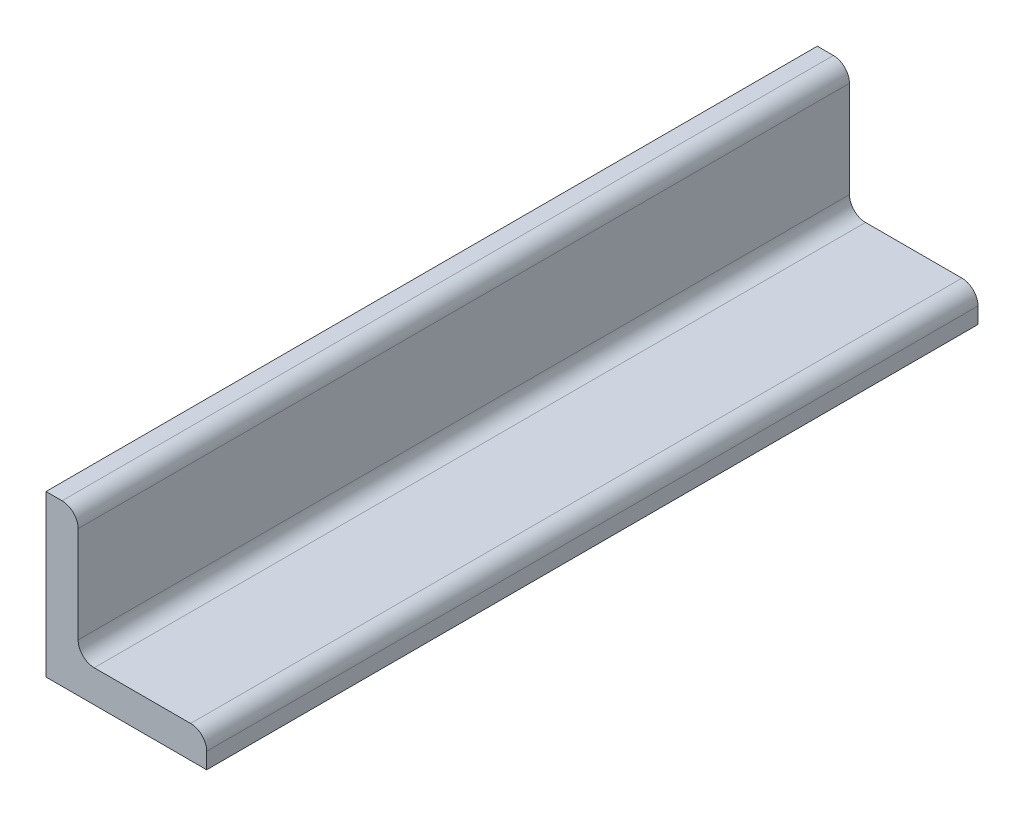
ISO-10303-21;
HEADER;
FILE_DESCRIPTION(('STEP AP214'),'2;1');
FILE_NAME('part.step','',(''),(''),'','','');
FILE_SCHEMA(('AUTOMOTIVE_DESIGN { 1 0 10303 214 1 1 1 1 }'));
ENDSEC;
DATA;
#1=APPLICATION_CONTEXT('core data for automotive mechanical design processes');
#2=APPLICATION_PROTOCOL_DEFINITION('international standard','automotive_design',2000,#1);
#3=PRODUCT_CONTEXT('',#1,'mechanical');
#4=PRODUCT('Part','Part','',(#3));
#5=PRODUCT_RELATED_PRODUCT_CATEGORY('part','',(#4));
#6=PRODUCT_DEFINITION_FORMATION('','',#4);
#7=PRODUCT_DEFINITION_CONTEXT('part definition',#1,'design');
#8=PRODUCT_DEFINITION('design','',#6,#7);
#9=PRODUCT_DEFINITION_SHAPE('','',#8);
#10=(LENGTH_UNIT() NAMED_UNIT(*) SI_UNIT(.MILLI.,.METRE.));
#11=(NAMED_UNIT(*) PLANE_ANGLE_UNIT() SI_UNIT($,.RADIAN.));
#12=(NAMED_UNIT(*) SI_UNIT($,.STERADIAN.) SOLID_ANGLE_UNIT());
#13=UNCERTAINTY_MEASURE_WITH_UNIT(LENGTH_MEASURE(1.E-05),#10,'distance_accuracy_value','');
#14=(GEOMETRIC_REPRESENTATION_CONTEXT(3) GLOBAL_UNCERTAINTY_ASSIGNED_CONTEXT((#13)) GLOBAL_UNIT_ASSIGNED_CONTEXT((#10,
#11,#12)) REPRESENTATION_CONTEXT('',''));
#15=CARTESIAN_POINT('',(0.,0.,0.));
#16=DIRECTION('',(0.,0.,1.));
#17=DIRECTION('',(1.,0.,0.));
#18=AXIS2_PLACEMENT_3D('',#15,#16,#17);
#19=CARTESIAN_POINT('',(0.897927251325018,63.8534276781816,304.8));
#20=DIRECTION('',(1.,0.,0.));
#21=DIRECTION('',(0.,0.,-1.));
#22=AXIS2_PLACEMENT_3D('',#19,#20,#21);
#23=PLANE('',#22);
#24=DIRECTION('',(0.,-1.,0.));
#25=VECTOR('',#24,1.);
#26=CARTESIAN_POINT('',(0.897927251325018,63.8534276781816,0.));
#27=LINE('',#26,#25);
#28=CARTESIAN_POINT('',(0.897927251325018,63.8534276781816,0.));
#29=VERTEX_POINT('',#28);
#30=CARTESIAN_POINT('',(0.897927251325018,0.353427678181561,0.));
#31=VERTEX_POINT('',#30);
#32=EDGE_CURVE('E135',#29,#31,#27,.T.);
#33=ORIENTED_EDGE('',*,*,#32,.T.);
#34=DIRECTION('',(0.,0.,-1.));
#35=VECTOR('',#34,1.);
#36=CARTESIAN_POINT('',(0.897927251325018,0.353427678181561,304.8));
#37=LINE('',#36,#35);
#38=CARTESIAN_POINT('',(0.897927251325018,0.353427678181561,304.8));
#39=VERTEX_POINT('',#38);
#40=EDGE_CURVE('E11',#39,#31,#37,.T.);
#41=ORIENTED_EDGE('',*,*,#40,.F.);
#42=DIRECTION('',(0.,-1.,0.));
#43=VECTOR('',#42,1.);
#44=CARTESIAN_POINT('',(0.897927251325018,63.8534276781816,304.8));
#45=LINE('',#44,#43);
#46=CARTESIAN_POINT('',(0.897927251325018,63.8534276781816,304.8));
#47=VERTEX_POINT('',#46);
#48=EDGE_CURVE('E151',#47,#39,#45,.T.);
#49=ORIENTED_EDGE('',*,*,#48,.F.);
#50=DIRECTION('',(0.,0.,-1.));
#51=VECTOR('',#50,1.);
#52=CARTESIAN_POINT('',(0.897927251325018,63.8534276781816,304.8));
#53=LINE('',#52,#51);
#54=EDGE_CURVE('E131',#47,#29,#53,.T.);
#55=ORIENTED_EDGE('',*,*,#54,.T.);
#56=EDGE_LOOP('',(#33,#41,#49,#55));
#57=FACE_BOUND('',#56,.T.);
#58=ADVANCED_FACE('F33',(#57),#23,.F.);
#59=CARTESIAN_POINT('',(0.897927251325018,0.353427678181561,304.8));
#60=DIRECTION('',(0.,1.,0.));
#61=DIRECTION('',(0.,0.,1.));
#62=AXIS2_PLACEMENT_3D('',#59,#60,#61);
#63=PLANE('',#62);
#64=DIRECTION('',(1.,0.,0.));
#65=VECTOR('',#64,1.);
#66=CARTESIAN_POINT('',(0.897927251325018,0.353427678181561,0.));
#67=LINE('',#66,#65);
#68=CARTESIAN_POINT('',(64.397927251325,0.353427678181561,0.));
#69=VERTEX_POINT('',#68);
#70=EDGE_CURVE('E138',#31,#69,#67,.T.);
#71=ORIENTED_EDGE('',*,*,#70,.T.);
#72=DIRECTION('',(0.,0.,-1.));
#73=VECTOR('',#72,1.);
#74=CARTESIAN_POINT('',(64.397927251325,0.353427678181561,304.8));
#75=LINE('',#74,#73);
#76=CARTESIAN_POINT('',(64.397927251325,0.353427678181561,304.8));
#77=VERTEX_POINT('',#76);
#78=EDGE_CURVE('E41',#77,#69,#75,.T.);
#79=ORIENTED_EDGE('',*,*,#78,.F.);
#80=DIRECTION('',(1.,0.,0.));
#81=VECTOR('',#80,1.);
#82=CARTESIAN_POINT('',(0.897927251325018,0.353427678181561,304.8));
#83=LINE('',#82,#81);
#84=EDGE_CURVE('E95',#39,#77,#83,.T.);
#85=ORIENTED_EDGE('',*,*,#84,.F.);
#86=ORIENTED_EDGE('',*,*,#40,.T.);
#87=EDGE_LOOP('',(#71,#79,#85,#86));
#88=FACE_BOUND('',#87,.T.);
#89=ADVANCED_FACE('F194',(#88),#63,.F.);
#90=CARTESIAN_POINT('',(64.397927251325,0.353427678181561,304.8));
#91=DIRECTION('',(-1.,0.,0.));
#92=DIRECTION('',(0.,0.,1.));
#93=AXIS2_PLACEMENT_3D('',#90,#91,#92);
#94=PLANE('',#93);
#95=DIRECTION('',(0.,1.,0.));
#96=VECTOR('',#95,1.);
#97=CARTESIAN_POINT('',(64.397927251325,0.353427678181561,0.));
#98=LINE('',#97,#96);
#99=CARTESIAN_POINT('',(64.397927251325,6.70342767818156,0.));
#100=VERTEX_POINT('',#99);
#101=EDGE_CURVE('E140',#69,#100,#98,.T.);
#102=ORIENTED_EDGE('',*,*,#101,.T.);
#103=DIRECTION('',(0.,0.,-1.));
#104=VECTOR('',#103,1.);
#105=CARTESIAN_POINT('',(64.397927251325,6.70342767818156,304.8));
#106=LINE('',#105,#104);
#107=CARTESIAN_POINT('',(64.397927251325,6.70342767818156,304.8));
#108=VERTEX_POINT('',#107);
#109=EDGE_CURVE('E161',#108,#100,#106,.T.);
#110=ORIENTED_EDGE('',*,*,#109,.F.);
#111=DIRECTION('',(0.,1.,0.));
#112=VECTOR('',#111,1.);
#113=CARTESIAN_POINT('',(64.397927251325,0.353427678181561,304.8));
#114=LINE('',#113,#112);
#115=EDGE_CURVE('E169',#77,#108,#114,.T.);
#116=ORIENTED_EDGE('',*,*,#115,.F.);
#117=ORIENTED_EDGE('',*,*,#78,.T.);
#118=EDGE_LOOP('',(#102,#110,#116,#117));
#119=FACE_BOUND('',#118,.T.);
#120=ADVANCED_FACE('F167',(#119),#94,.F.);
#121=CARTESIAN_POINT('',(58.047927251325,6.70342767818156,304.8));
#122=DIRECTION('',(0.,0.,-1.));
#123=DIRECTION('',(-1.,0.,0.));
#124=AXIS2_PLACEMENT_3D('',#121,#122,#123);
#125=CYLINDRICAL_SURFACE('',#124,6.35);
#126=CARTESIAN_POINT('',(58.047927251325,6.70342767818156,0.));
#127=DIRECTION('',(0.,0.,1.));
#128=DIRECTION('',(1.,0.,0.));
#129=AXIS2_PLACEMENT_3D('',#126,#127,#128);
#130=CIRCLE('',#129,6.35);
#131=CARTESIAN_POINT('',(58.047927251325,13.0534276781816,0.));
#132=VERTEX_POINT('',#131);
#133=EDGE_CURVE('E142',#100,#132,#130,.T.);
#134=ORIENTED_EDGE('',*,*,#133,.T.);
#135=DIRECTION('',(0.,0.,-1.));
#136=VECTOR('',#135,1.);
#137=CARTESIAN_POINT('',(58.047927251325,13.0534276781816,304.8));
#138=LINE('',#137,#136);
#139=CARTESIAN_POINT('',(58.047927251325,13.0534276781816,304.8));
#140=VERTEX_POINT('',#139);
#141=EDGE_CURVE('E158',#140,#132,#138,.T.);
#142=ORIENTED_EDGE('',*,*,#141,.F.);
#143=CARTESIAN_POINT('',(58.047927251325,6.70342767818156,304.8));
#144=DIRECTION('',(0.,0.,1.));
#145=DIRECTION('',(1.,0.,0.));
#146=AXIS2_PLACEMENT_3D('',#143,#144,#145);
#147=CIRCLE('',#146,6.35);
#148=EDGE_CURVE('E185',#108,#140,#147,.T.);
#149=ORIENTED_EDGE('',*,*,#148,.F.);
#150=ORIENTED_EDGE('',*,*,#109,.T.);
#151=EDGE_LOOP('',(#134,#142,#149,#150));
#152=FACE_BOUND('',#151,.T.);
#153=ADVANCED_FACE('F178',(#152),#125,.T.);
#154=CARTESIAN_POINT('',(58.047927251325,13.0534276781816,304.8));
#155=DIRECTION('',(0.,-1.,0.));
#156=DIRECTION('',(0.,0.,-1.));
#157=AXIS2_PLACEMENT_3D('',#154,#155,#156);
#158=PLANE('',#157);
#159=DIRECTION('',(-1.,0.,0.));
#160=VECTOR('',#159,1.);
#161=CARTESIAN_POINT('',(58.047927251325,13.0534276781816,0.));
#162=LINE('',#161,#160);
#163=CARTESIAN_POINT('',(19.947927251325,13.0534276781816,0.));
#164=VERTEX_POINT('',#163);
#165=EDGE_CURVE('E144',#132,#164,#162,.T.);
#166=ORIENTED_EDGE('',*,*,#165,.T.);
#167=DIRECTION('',(0.,0.,-1.));
#168=VECTOR('',#167,1.);
#169=CARTESIAN_POINT('',(19.947927251325,13.0534276781816,304.8));
#170=LINE('',#169,#168);
#171=CARTESIAN_POINT('',(19.947927251325,13.0534276781816,304.8));
#172=VERTEX_POINT('',#171);
#173=EDGE_CURVE('E155',#172,#164,#170,.T.);
#174=ORIENTED_EDGE('',*,*,#173,.F.);
#175=DIRECTION('',(-1.,0.,0.));
#176=VECTOR('',#175,1.);
#177=CARTESIAN_POINT('',(58.047927251325,13.0534276781816,304.8));
#178=LINE('',#177,#176);
#179=EDGE_CURVE('E184',#140,#172,#178,.T.);
#180=ORIENTED_EDGE('',*,*,#179,.F.);
#181=ORIENTED_EDGE('',*,*,#141,.T.);
#182=EDGE_LOOP('',(#166,#174,#180,#181));
#183=FACE_BOUND('',#182,.T.);
#184=ADVANCED_FACE('F182',(#183),#158,.F.);
#185=CARTESIAN_POINT('',(19.947927251325,19.4034276781816,304.8));
#186=DIRECTION('',(0.,0.,-1.));
#187=DIRECTION('',(-1.,0.,0.));
#188=AXIS2_PLACEMENT_3D('',#185,#186,#187);
#189=CYLINDRICAL_SURFACE('',#188,6.34999999999999);
#190=CARTESIAN_POINT('',(19.947927251325,19.4034276781816,0.));
#191=DIRECTION('',(0.,0.,-1.));
#192=DIRECTION('',(1.,0.,0.));
#193=AXIS2_PLACEMENT_3D('',#190,#191,#192);
#194=CIRCLE('',#193,6.34999999999999);
#195=CARTESIAN_POINT('',(13.597927251325,19.4034276781816,0.));
#196=VERTEX_POINT('',#195);
#197=EDGE_CURVE('E146',#164,#196,#194,.T.);
#198=ORIENTED_EDGE('',*,*,#197,.T.);
#199=DIRECTION('',(0.,0.,-1.));
#200=VECTOR('',#199,1.);
#201=CARTESIAN_POINT('',(13.597927251325,19.4034276781816,304.8));
#202=LINE('',#201,#200);
#203=CARTESIAN_POINT('',(13.597927251325,19.4034276781816,304.8));
#204=VERTEX_POINT('',#203);
#205=EDGE_CURVE('E126',#204,#196,#202,.T.);
#206=ORIENTED_EDGE('',*,*,#205,.F.);
#207=CARTESIAN_POINT('',(19.947927251325,19.4034276781816,304.8));
#208=DIRECTION('',(0.,0.,-1.));
#209=DIRECTION('',(1.,0.,0.));
#210=AXIS2_PLACEMENT_3D('',#207,#208,#209);
#211=CIRCLE('',#210,6.34999999999999);
#212=EDGE_CURVE('E117',#172,#204,#211,.T.);
#213=ORIENTED_EDGE('',*,*,#212,.F.);
#214=ORIENTED_EDGE('',*,*,#173,.T.);
#215=EDGE_LOOP('',(#198,#206,#213,#214));
#216=FACE_BOUND('',#215,.T.);
#217=ADVANCED_FACE('F206',(#216),#189,.F.);
#218=CARTESIAN_POINT('',(13.597927251325,19.4034276781816,304.8));
#219=DIRECTION('',(-1.,0.,0.));
#220=DIRECTION('',(0.,0.,1.));
#221=AXIS2_PLACEMENT_3D('',#218,#219,#220);
#222=PLANE('',#221);
#223=DIRECTION('',(0.,1.,0.));
#224=VECTOR('',#223,1.);
#225=CARTESIAN_POINT('',(13.597927251325,19.4034276781816,0.));
#226=LINE('',#225,#224);
#227=CARTESIAN_POINT('',(13.597927251325,57.5034276781816,0.));
#228=VERTEX_POINT('',#227);
#229=EDGE_CURVE('E125',#196,#228,#226,.T.);
#230=ORIENTED_EDGE('',*,*,#229,.T.);
#231=DIRECTION('',(0.,0.,-1.));
#232=VECTOR('',#231,1.);
#233=CARTESIAN_POINT('',(13.597927251325,57.5034276781816,304.8));
#234=LINE('',#233,#232);
#235=CARTESIAN_POINT('',(13.597927251325,57.5034276781816,304.8));
#236=VERTEX_POINT('',#235);
#237=EDGE_CURVE('E122',#236,#228,#234,.T.);
#238=ORIENTED_EDGE('',*,*,#237,.F.);
#239=DIRECTION('',(0.,1.,0.));
#240=VECTOR('',#239,1.);
#241=CARTESIAN_POINT('',(13.597927251325,19.4034276781816,304.8));
#242=LINE('',#241,#240);
#243=EDGE_CURVE('E111',#204,#236,#242,.T.);
#244=ORIENTED_EDGE('',*,*,#243,.F.);
#245=ORIENTED_EDGE('',*,*,#205,.T.);
#246=EDGE_LOOP('',(#230,#238,#244,#245));
#247=FACE_BOUND('',#246,.T.);
#248=ADVANCED_FACE('F123',(#247),#222,.F.);
#249=CARTESIAN_POINT('',(7.24792725132502,57.5034276781816,304.8));
#250=DIRECTION('',(0.,0.,-1.));
#251=DIRECTION('',(-1.,0.,0.));
#252=AXIS2_PLACEMENT_3D('',#249,#250,#251);
#253=CYLINDRICAL_SURFACE('',#252,6.35);
#254=CARTESIAN_POINT('',(7.24792725132502,57.5034276781816,0.));
#255=DIRECTION('',(0.,0.,1.));
#256=DIRECTION('',(1.,0.,0.));
#257=AXIS2_PLACEMENT_3D('',#254,#255,#256);
#258=CIRCLE('',#257,6.35);
#259=CARTESIAN_POINT('',(7.24792725132502,63.8534276781816,0.));
#260=VERTEX_POINT('',#259);
#261=EDGE_CURVE('E81',#228,#260,#258,.T.);
#262=ORIENTED_EDGE('',*,*,#261,.T.);
#263=DIRECTION('',(0.,0.,-1.));
#264=VECTOR('',#263,1.);
#265=CARTESIAN_POINT('',(7.24792725132502,63.8534276781816,304.8));
#266=LINE('',#265,#264);
#267=CARTESIAN_POINT('',(7.24792725132502,63.8534276781816,304.8));
#268=VERTEX_POINT('',#267);
#269=EDGE_CURVE('E127',#268,#260,#266,.T.);
#270=ORIENTED_EDGE('',*,*,#269,.F.);
#271=CARTESIAN_POINT('',(7.24792725132502,57.5034276781816,304.8));
#272=DIRECTION('',(0.,0.,1.));
#273=DIRECTION('',(1.,0.,0.));
#274=AXIS2_PLACEMENT_3D('',#271,#272,#273);
#275=CIRCLE('',#274,6.35);
#276=EDGE_CURVE('E115',#236,#268,#275,.T.);
#277=ORIENTED_EDGE('',*,*,#276,.F.);
#278=ORIENTED_EDGE('',*,*,#237,.T.);
#279=EDGE_LOOP('',(#262,#270,#277,#278));
#280=FACE_BOUND('',#279,.T.);
#281=ADVANCED_FACE('F129',(#280),#253,.T.);
#282=CARTESIAN_POINT('',(7.24792725132502,63.8534276781816,304.8));
#283=DIRECTION('',(0.,-1.,0.));
#284=DIRECTION('',(0.,0.,-1.));
#285=AXIS2_PLACEMENT_3D('',#282,#283,#284);
#286=PLANE('',#285);
#287=DIRECTION('',(-1.,0.,0.));
#288=VECTOR('',#287,1.);
#289=CARTESIAN_POINT('',(7.24792725132502,63.8534276781816,0.));
#290=LINE('',#289,#288);
#291=EDGE_CURVE('E87',#260,#29,#290,.T.);
#292=ORIENTED_EDGE('',*,*,#291,.T.);
#293=ORIENTED_EDGE('',*,*,#54,.F.);
#294=DIRECTION('',(-1.,0.,0.));
#295=VECTOR('',#294,1.);
#296=CARTESIAN_POINT('',(7.24792725132502,63.8534276781816,304.8));
#297=LINE('',#296,#295);
#298=EDGE_CURVE('E49',#268,#47,#297,.T.);
#299=ORIENTED_EDGE('',*,*,#298,.F.);
#300=ORIENTED_EDGE('',*,*,#269,.T.);
#301=EDGE_LOOP('',(#292,#293,#299,#300));
#302=FACE_BOUND('',#301,.T.);
#303=ADVANCED_FACE('F214',(#302),#286,.F.);
#304=CARTESIAN_POINT('',(58.047927251325,6.70342767818156,304.8));
#305=DIRECTION('',(0.,0.,1.));
#306=DIRECTION('',(1.,0.,0.));
#307=AXIS2_PLACEMENT_3D('',#304,#305,#306);
#308=PLANE('',#307);
#309=ORIENTED_EDGE('',*,*,#48,.T.);
#310=ORIENTED_EDGE('',*,*,#84,.T.);
#311=ORIENTED_EDGE('',*,*,#115,.T.);
#312=ORIENTED_EDGE('',*,*,#148,.T.);
#313=ORIENTED_EDGE('',*,*,#179,.T.);
#314=ORIENTED_EDGE('',*,*,#212,.T.);
#315=ORIENTED_EDGE('',*,*,#243,.T.);
#316=ORIENTED_EDGE('',*,*,#276,.T.);
#317=ORIENTED_EDGE('',*,*,#298,.T.);
#318=EDGE_LOOP('',(#309,#310,#311,#312,#313,#314,#315,#316,#317));
#319=FACE_BOUND('',#318,.T.);
#320=ADVANCED_FACE('F113',(#319),#308,.T.);
#321=CARTESIAN_POINT('',(58.047927251325,6.70342767818156,0.));
#322=DIRECTION('',(0.,0.,1.));
#323=DIRECTION('',(1.,0.,0.));
#324=AXIS2_PLACEMENT_3D('',#321,#322,#323);
#325=PLANE('',#324);
#326=ORIENTED_EDGE('',*,*,#32,.F.);
#327=ORIENTED_EDGE('',*,*,#291,.F.);
#328=ORIENTED_EDGE('',*,*,#261,.F.);
#329=ORIENTED_EDGE('',*,*,#229,.F.);
#330=ORIENTED_EDGE('',*,*,#197,.F.);
#331=ORIENTED_EDGE('',*,*,#165,.F.);
#332=ORIENTED_EDGE('',*,*,#133,.F.);
#333=ORIENTED_EDGE('',*,*,#101,.F.);
#334=ORIENTED_EDGE('',*,*,#70,.F.);
#335=EDGE_LOOP('',(#326,#327,#328,#329,#330,#331,#332,#333,#334));
#336=FACE_BOUND('',#335,.T.);
#337=ADVANCED_FACE('F173',(#336),#325,.F.);
#338=CLOSED_SHELL('',(#58,#89,#120,#153,#184,#217,#248,#281,#303,#320,#337));
#339=MANIFOLD_SOLID_BREP('B2',#338);
#340=ADVANCED_BREP_SHAPE_REPRESENTATION('',(#18,#339),#14);
#341=SHAPE_DEFINITION_REPRESENTATION(#9,#340);
ENDSEC;
END-ISO-10303-21;
